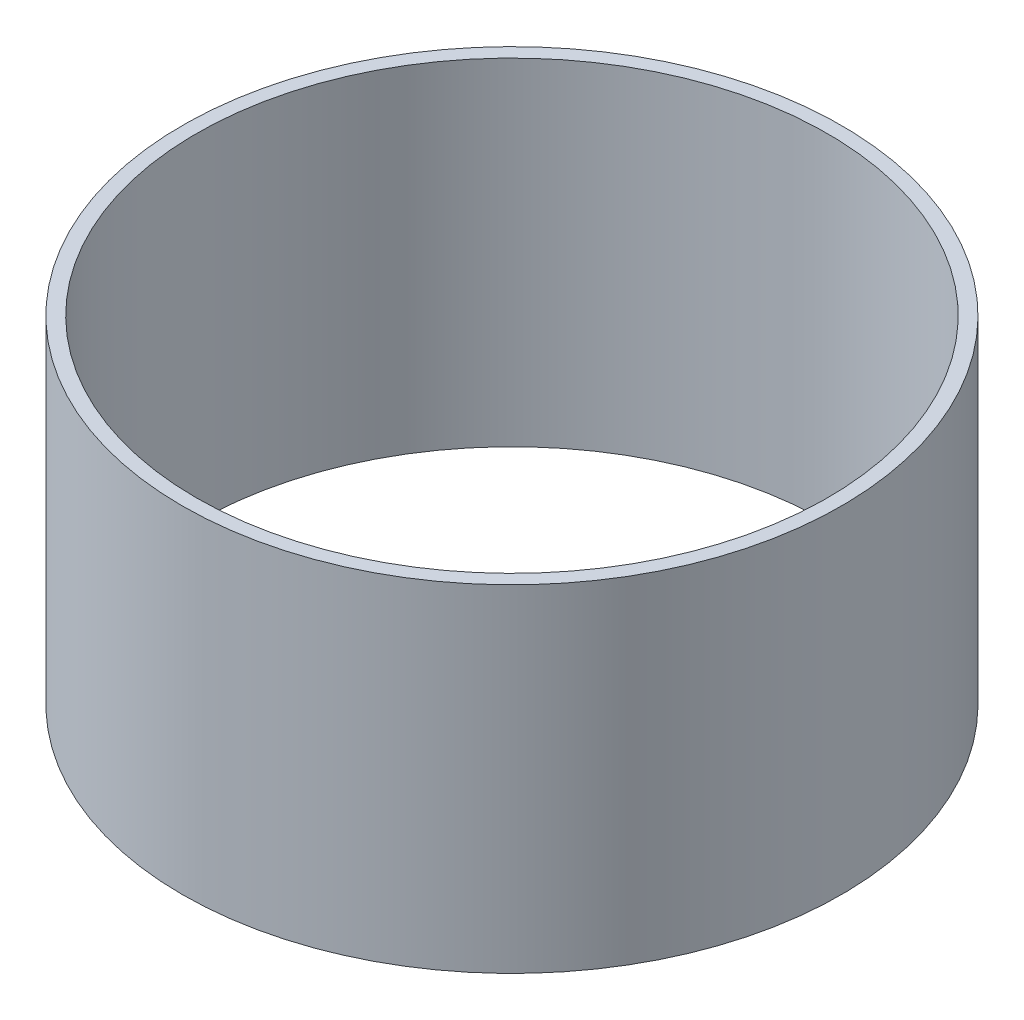
ISO-10303-21;
HEADER;
FILE_DESCRIPTION(('STEP AP214'),'2;1');
FILE_NAME('part.step','',(''),(''),'','','');
FILE_SCHEMA(('AUTOMOTIVE_DESIGN { 1 0 10303 214 1 1 1 1 }'));
ENDSEC;
DATA;
#1=APPLICATION_CONTEXT('core data for automotive mechanical design processes');
#2=APPLICATION_PROTOCOL_DEFINITION('international standard','automotive_design',2000,#1);
#3=PRODUCT_CONTEXT('',#1,'mechanical');
#4=PRODUCT('Part','Part','',(#3));
#5=PRODUCT_RELATED_PRODUCT_CATEGORY('part','',(#4));
#6=PRODUCT_DEFINITION_FORMATION('','',#4);
#7=PRODUCT_DEFINITION_CONTEXT('part definition',#1,'design');
#8=PRODUCT_DEFINITION('design','',#6,#7);
#9=PRODUCT_DEFINITION_SHAPE('','',#8);
#10=(LENGTH_UNIT() NAMED_UNIT(*) SI_UNIT(.MILLI.,.METRE.));
#11=(NAMED_UNIT(*) PLANE_ANGLE_UNIT() SI_UNIT($,.RADIAN.));
#12=(NAMED_UNIT(*) SI_UNIT($,.STERADIAN.) SOLID_ANGLE_UNIT());
#13=UNCERTAINTY_MEASURE_WITH_UNIT(LENGTH_MEASURE(1.E-05),#10,'distance_accuracy_value','');
#14=(GEOMETRIC_REPRESENTATION_CONTEXT(3) GLOBAL_UNCERTAINTY_ASSIGNED_CONTEXT((#13)) GLOBAL_UNIT_ASSIGNED_CONTEXT((#10,
#11,#12)) REPRESENTATION_CONTEXT('',''));
#15=CARTESIAN_POINT('',(0.,0.,0.));
#16=DIRECTION('',(0.,0.,1.));
#17=DIRECTION('',(1.,0.,0.));
#18=AXIS2_PLACEMENT_3D('',#15,#16,#17);
#19=CARTESIAN_POINT('',(0.,-304.8,0.));
#20=DIRECTION('',(0.,1.,0.));
#21=DIRECTION('',(0.,0.,1.));
#22=AXIS2_PLACEMENT_3D('',#19,#20,#21);
#23=CYLINDRICAL_SURFACE('',#22,298.45);
#24=CARTESIAN_POINT('',(0.,-304.8,0.));
#25=DIRECTION('',(0.,1.,0.));
#26=DIRECTION('',(0.,0.,1.));
#27=AXIS2_PLACEMENT_3D('',#24,#25,#26);
#28=CIRCLE('',#27,298.45);
#29=CARTESIAN_POINT('',(0.,-304.8,298.45));
#30=VERTEX_POINT('',#29);
#31=EDGE_CURVE('E10',#30,#30,#28,.T.);
#32=CARTESIAN_POINT('',(0.,0.,0.));
#33=DIRECTION('',(0.,1.,0.));
#34=DIRECTION('',(0.,0.,1.));
#35=AXIS2_PLACEMENT_3D('',#32,#33,#34);
#36=CIRCLE('',#35,298.45);
#37=CARTESIAN_POINT('',(0.,0.,298.45));
#38=VERTEX_POINT('',#37);
#39=EDGE_CURVE('E34',#38,#38,#36,.T.);
#40=CARTESIAN_POINT('',(0.,-304.8,298.45));
#41=CARTESIAN_POINT('',(0.,-301.625,298.45));
#42=CARTESIAN_POINT('',(0.,-298.45,298.45));
#43=CARTESIAN_POINT('',(0.,-292.1,298.45));
#44=CARTESIAN_POINT('',(0.,-288.925,298.45));
#45=CARTESIAN_POINT('',(0.,-282.575,298.45));
#46=CARTESIAN_POINT('',(0.,-279.4,298.45));
#47=CARTESIAN_POINT('',(0.,-273.05,298.45));
#48=CARTESIAN_POINT('',(0.,-269.875,298.45));
#49=CARTESIAN_POINT('',(0.,-263.525,298.45));
#50=CARTESIAN_POINT('',(0.,-260.35,298.45));
#51=CARTESIAN_POINT('',(0.,-254.,298.45));
#52=CARTESIAN_POINT('',(0.,-250.825,298.45));
#53=CARTESIAN_POINT('',(0.,-244.475,298.45));
#54=CARTESIAN_POINT('',(0.,-241.3,298.45));
#55=CARTESIAN_POINT('',(0.,-234.95,298.45));
#56=CARTESIAN_POINT('',(0.,-231.775,298.45));
#57=CARTESIAN_POINT('',(0.,-225.425,298.45));
#58=CARTESIAN_POINT('',(0.,-222.25,298.45));
#59=CARTESIAN_POINT('',(0.,-215.9,298.45));
#60=CARTESIAN_POINT('',(0.,-212.725,298.45));
#61=CARTESIAN_POINT('',(0.,-206.375,298.45));
#62=CARTESIAN_POINT('',(0.,-203.2,298.45));
#63=CARTESIAN_POINT('',(0.,-196.85,298.45));
#64=CARTESIAN_POINT('',(0.,-193.675,298.45));
#65=CARTESIAN_POINT('',(0.,-187.325,298.45));
#66=CARTESIAN_POINT('',(0.,-184.15,298.45));
#67=CARTESIAN_POINT('',(0.,-177.8,298.45));
#68=CARTESIAN_POINT('',(0.,-174.625,298.45));
#69=CARTESIAN_POINT('',(0.,-168.275,298.45));
#70=CARTESIAN_POINT('',(0.,-165.1,298.45));
#71=CARTESIAN_POINT('',(0.,-158.75,298.45));
#72=CARTESIAN_POINT('',(0.,-155.575,298.45));
#73=CARTESIAN_POINT('',(0.,-149.225,298.45));
#74=CARTESIAN_POINT('',(0.,-146.05,298.45));
#75=CARTESIAN_POINT('',(0.,-139.7,298.45));
#76=CARTESIAN_POINT('',(0.,-136.525,298.45));
#77=CARTESIAN_POINT('',(0.,-130.175,298.45));
#78=CARTESIAN_POINT('',(0.,-127.,298.45));
#79=CARTESIAN_POINT('',(0.,-120.65,298.45));
#80=CARTESIAN_POINT('',(0.,-117.475,298.45));
#81=CARTESIAN_POINT('',(0.,-111.125,298.45));
#82=CARTESIAN_POINT('',(0.,-107.95,298.45));
#83=CARTESIAN_POINT('',(0.,-101.6,298.45));
#84=CARTESIAN_POINT('',(0.,-98.425,298.45));
#85=CARTESIAN_POINT('',(0.,-92.075,298.45));
#86=CARTESIAN_POINT('',(0.,-88.9,298.45));
#87=CARTESIAN_POINT('',(0.,-82.55,298.45));
#88=CARTESIAN_POINT('',(0.,-79.375,298.45));
#89=CARTESIAN_POINT('',(0.,-73.025,298.45));
#90=CARTESIAN_POINT('',(0.,-69.85,298.45));
#91=CARTESIAN_POINT('',(0.,-63.5,298.45));
#92=CARTESIAN_POINT('',(0.,-60.325,298.45));
#93=CARTESIAN_POINT('',(0.,-53.975,298.45));
#94=CARTESIAN_POINT('',(0.,-50.8,298.45));
#95=CARTESIAN_POINT('',(0.,-44.45,298.45));
#96=CARTESIAN_POINT('',(0.,-41.275,298.45));
#97=CARTESIAN_POINT('',(0.,-34.925,298.45));
#98=CARTESIAN_POINT('',(0.,-31.75,298.45));
#99=CARTESIAN_POINT('',(0.,-25.4,298.45));
#100=CARTESIAN_POINT('',(0.,-22.225,298.45));
#101=CARTESIAN_POINT('',(0.,-15.875,298.45));
#102=CARTESIAN_POINT('',(0.,-12.7,298.45));
#103=CARTESIAN_POINT('',(0.,-6.35,298.45));
#104=CARTESIAN_POINT('',(0.,-3.175,298.45));
#105=CARTESIAN_POINT('',(0.,0.,298.45));
#106=B_SPLINE_CURVE_WITH_KNOTS('',3,(#40,#41,#42,#43,#44,#45,#46,#47,#48,#49,#50,#51,#52,#53,
#54,#55,#56,#57,#58,#59,#60,#61,#62,#63,#64,#65,#66,#67,#68,#69,#70,#71,#72,#73,#74,#75,#76,#77,
#78,#79,#80,#81,#82,#83,#84,#85,#86,#87,#88,#89,#90,#91,#92,#93,#94,#95,#96,#97,#98,#99,#100,
#101,#102,#103,#104,#105),.UNSPECIFIED.,.F.,.F.,(4,2,2,2,2,2,2,2,2,2,2,2,2,2,2,2,2,2,2,2,2,2,2,
2,2,2,2,2,2,2,2,2,4),(0.,9.52500000000001,19.05,28.575,38.1,47.625,57.15,66.675,76.2,
85.7250000000001,95.2500000000001,104.775,114.3,123.825,133.35,142.875,152.4,161.925,171.45,
180.975,190.5,200.025,209.55,219.075,228.6,238.125,247.65,257.175,266.7,276.225,285.75,295.275,
304.8),.UNSPECIFIED.);
#107=EDGE_CURVE('BSEAM31',#30,#38,#106,.T.);
#108=ORIENTED_EDGE('',*,*,#31,.T.);
#109=ORIENTED_EDGE('',*,*,#39,.F.);
#110=ORIENTED_EDGE('',*,*,#107,.T.);
#111=ORIENTED_EDGE('',*,*,#107,.F.);
#112=EDGE_LOOP('',(#108,#110,#109,#111));
#113=FACE_BOUND('',#112,.T.);
#114=ADVANCED_FACE('F31',(#113),#23,.T.);
#115=CARTESIAN_POINT('',(0.,-304.8,0.));
#116=DIRECTION('',(0.,1.,0.));
#117=DIRECTION('',(0.,0.,1.));
#118=AXIS2_PLACEMENT_3D('',#115,#116,#117);
#119=PLANE('',#118);
#120=CARTESIAN_POINT('',(0.,-304.8,0.));
#121=DIRECTION('',(0.,1.,0.));
#122=DIRECTION('',(0.,0.,1.));
#123=AXIS2_PLACEMENT_3D('',#120,#121,#122);
#124=CIRCLE('',#123,285.75);
#125=CARTESIAN_POINT('',(0.,-304.8,285.75));
#126=VERTEX_POINT('',#125);
#127=EDGE_CURVE('E41',#126,#126,#124,.T.);
#128=ORIENTED_EDGE('',*,*,#127,.T.);
#129=EDGE_LOOP('',(#128));
#130=FACE_BOUND('',#129,.T.);
#131=ORIENTED_EDGE('',*,*,#31,.F.);
#132=EDGE_LOOP('',(#131));
#133=FACE_BOUND('',#132,.T.);
#134=ADVANCED_FACE('F49',(#130,#133),#119,.F.);
#135=CARTESIAN_POINT('',(0.,0.,0.));
#136=DIRECTION('',(0.,1.,0.));
#137=DIRECTION('',(0.,0.,1.));
#138=AXIS2_PLACEMENT_3D('',#135,#136,#137);
#139=PLANE('',#138);
#140=CARTESIAN_POINT('',(0.,0.,0.));
#141=DIRECTION('',(0.,1.,0.));
#142=DIRECTION('',(0.,0.,1.));
#143=AXIS2_PLACEMENT_3D('',#140,#141,#142);
#144=CIRCLE('',#143,285.75);
#145=CARTESIAN_POINT('',(0.,0.,285.75));
#146=VERTEX_POINT('',#145);
#147=EDGE_CURVE('E43',#146,#146,#144,.T.);
#148=ORIENTED_EDGE('',*,*,#147,.F.);
#149=EDGE_LOOP('',(#148));
#150=FACE_BOUND('',#149,.T.);
#151=ORIENTED_EDGE('',*,*,#39,.T.);
#152=EDGE_LOOP('',(#151));
#153=FACE_BOUND('',#152,.T.);
#154=ADVANCED_FACE('F55',(#150,#153),#139,.T.);
#155=CARTESIAN_POINT('',(0.,-304.8,0.));
#156=DIRECTION('',(0.,1.,0.));
#157=DIRECTION('',(0.,0.,1.));
#158=AXIS2_PLACEMENT_3D('',#155,#156,#157);
#159=CYLINDRICAL_SURFACE('',#158,285.75);
#160=CARTESIAN_POINT('',(0.,-304.8,285.75));
#161=CARTESIAN_POINT('',(0.,-301.625,285.75));
#162=CARTESIAN_POINT('',(0.,-298.45,285.75));
#163=CARTESIAN_POINT('',(0.,-292.1,285.75));
#164=CARTESIAN_POINT('',(0.,-288.925,285.75));
#165=CARTESIAN_POINT('',(0.,-282.575,285.75));
#166=CARTESIAN_POINT('',(0.,-279.4,285.75));
#167=CARTESIAN_POINT('',(0.,-273.05,285.75));
#168=CARTESIAN_POINT('',(0.,-269.875,285.75));
#169=CARTESIAN_POINT('',(0.,-263.525,285.75));
#170=CARTESIAN_POINT('',(0.,-260.35,285.75));
#171=CARTESIAN_POINT('',(0.,-254.,285.75));
#172=CARTESIAN_POINT('',(0.,-250.825,285.75));
#173=CARTESIAN_POINT('',(0.,-244.475,285.75));
#174=CARTESIAN_POINT('',(0.,-241.3,285.75));
#175=CARTESIAN_POINT('',(0.,-234.95,285.75));
#176=CARTESIAN_POINT('',(0.,-231.775,285.75));
#177=CARTESIAN_POINT('',(0.,-225.425,285.75));
#178=CARTESIAN_POINT('',(0.,-222.25,285.75));
#179=CARTESIAN_POINT('',(0.,-215.9,285.75));
#180=CARTESIAN_POINT('',(0.,-212.725,285.75));
#181=CARTESIAN_POINT('',(0.,-206.375,285.75));
#182=CARTESIAN_POINT('',(0.,-203.2,285.75));
#183=CARTESIAN_POINT('',(0.,-196.85,285.75));
#184=CARTESIAN_POINT('',(0.,-193.675,285.75));
#185=CARTESIAN_POINT('',(0.,-187.325,285.75));
#186=CARTESIAN_POINT('',(0.,-184.15,285.75));
#187=CARTESIAN_POINT('',(0.,-177.8,285.75));
#188=CARTESIAN_POINT('',(0.,-174.625,285.75));
#189=CARTESIAN_POINT('',(0.,-168.275,285.75));
#190=CARTESIAN_POINT('',(0.,-165.1,285.75));
#191=CARTESIAN_POINT('',(0.,-158.75,285.75));
#192=CARTESIAN_POINT('',(0.,-155.575,285.75));
#193=CARTESIAN_POINT('',(0.,-149.225,285.75));
#194=CARTESIAN_POINT('',(0.,-146.05,285.75));
#195=CARTESIAN_POINT('',(0.,-139.7,285.75));
#196=CARTESIAN_POINT('',(0.,-136.525,285.75));
#197=CARTESIAN_POINT('',(0.,-130.175,285.75));
#198=CARTESIAN_POINT('',(0.,-127.,285.75));
#199=CARTESIAN_POINT('',(0.,-120.65,285.75));
#200=CARTESIAN_POINT('',(0.,-117.475,285.75));
#201=CARTESIAN_POINT('',(0.,-111.125,285.75));
#202=CARTESIAN_POINT('',(0.,-107.95,285.75));
#203=CARTESIAN_POINT('',(0.,-101.6,285.75));
#204=CARTESIAN_POINT('',(0.,-98.425,285.75));
#205=CARTESIAN_POINT('',(0.,-92.075,285.75));
#206=CARTESIAN_POINT('',(0.,-88.9,285.75));
#207=CARTESIAN_POINT('',(0.,-82.55,285.75));
#208=CARTESIAN_POINT('',(0.,-79.375,285.75));
#209=CARTESIAN_POINT('',(0.,-73.025,285.75));
#210=CARTESIAN_POINT('',(0.,-69.85,285.75));
#211=CARTESIAN_POINT('',(0.,-63.5,285.75));
#212=CARTESIAN_POINT('',(0.,-60.325,285.75));
#213=CARTESIAN_POINT('',(0.,-53.975,285.75));
#214=CARTESIAN_POINT('',(0.,-50.8,285.75));
#215=CARTESIAN_POINT('',(0.,-44.45,285.75));
#216=CARTESIAN_POINT('',(0.,-41.275,285.75));
#217=CARTESIAN_POINT('',(0.,-34.925,285.75));
#218=CARTESIAN_POINT('',(0.,-31.75,285.75));
#219=CARTESIAN_POINT('',(0.,-25.4,285.75));
#220=CARTESIAN_POINT('',(0.,-22.225,285.75));
#221=CARTESIAN_POINT('',(0.,-15.875,285.75));
#222=CARTESIAN_POINT('',(0.,-12.7,285.75));
#223=CARTESIAN_POINT('',(0.,-6.35,285.75));
#224=CARTESIAN_POINT('',(0.,-3.175,285.75));
#225=CARTESIAN_POINT('',(0.,0.,285.75));
#226=B_SPLINE_CURVE_WITH_KNOTS('',3,(#160,#161,#162,#163,#164,#165,#166,#167,#168,#169,#170,
#171,#172,#173,#174,#175,#176,#177,#178,#179,#180,#181,#182,#183,#184,#185,#186,#187,#188,#189,
#190,#191,#192,#193,#194,#195,#196,#197,#198,#199,#200,#201,#202,#203,#204,#205,#206,#207,#208,
#209,#210,#211,#212,#213,#214,#215,#216,#217,#218,#219,#220,#221,#222,#223,#224,#225),
.UNSPECIFIED.,.F.,.F.,(4,2,2,2,2,2,2,2,2,2,2,2,2,2,2,2,2,2,2,2,2,2,2,2,2,2,2,2,2,2,2,2,4),(0.,
9.52499999999995,19.05,28.575,38.1,47.625,57.15,66.675,76.2,85.725,95.25,104.775,114.3,123.825,
133.35,142.875,152.4,161.925,171.45,180.975,190.5,200.025,209.55,219.075,228.6,238.125,247.65,
257.175,266.7,276.225,285.75,295.275,304.8),.UNSPECIFIED.);
#227=EDGE_CURVE('BSEAM52',#126,#146,#226,.T.);
#228=ORIENTED_EDGE('',*,*,#127,.F.);
#229=ORIENTED_EDGE('',*,*,#147,.T.);
#230=ORIENTED_EDGE('',*,*,#227,.T.);
#231=ORIENTED_EDGE('',*,*,#227,.F.);
#232=EDGE_LOOP('',(#228,#230,#229,#231));
#233=FACE_BOUND('',#232,.T.);
#234=ADVANCED_FACE('F52',(#233),#159,.F.);
#235=CLOSED_SHELL('',(#114,#134,#154,#234));
#236=MANIFOLD_SOLID_BREP('B2',#235);
#237=ADVANCED_BREP_SHAPE_REPRESENTATION('',(#18,#236),#14);
#238=SHAPE_DEFINITION_REPRESENTATION(#9,#237);
ENDSEC;
END-ISO-10303-21;
